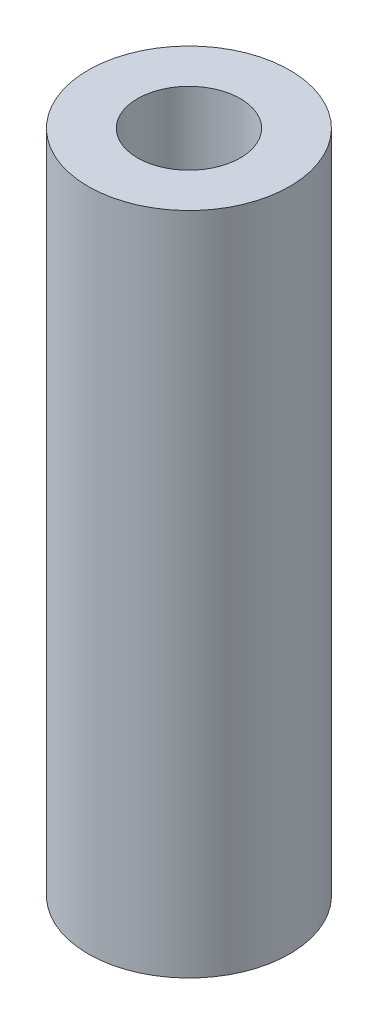
ISO-10303-21;
HEADER;
FILE_DESCRIPTION(('STEP AP214'),'2;1');
FILE_NAME('part.step','',(''),(''),'','','');
FILE_SCHEMA(('AUTOMOTIVE_DESIGN { 1 0 10303 214 1 1 1 1 }'));
ENDSEC;
DATA;
#1=APPLICATION_CONTEXT('core data for automotive mechanical design processes');
#2=APPLICATION_PROTOCOL_DEFINITION('international standard','automotive_design',2000,#1);
#3=PRODUCT_CONTEXT('',#1,'mechanical');
#4=PRODUCT('Part','Part','',(#3));
#5=PRODUCT_RELATED_PRODUCT_CATEGORY('part','',(#4));
#6=PRODUCT_DEFINITION_FORMATION('','',#4);
#7=PRODUCT_DEFINITION_CONTEXT('part definition',#1,'design');
#8=PRODUCT_DEFINITION('design','',#6,#7);
#9=PRODUCT_DEFINITION_SHAPE('','',#8);
#10=(LENGTH_UNIT() NAMED_UNIT(*) SI_UNIT(.MILLI.,.METRE.));
#11=(NAMED_UNIT(*) PLANE_ANGLE_UNIT() SI_UNIT($,.RADIAN.));
#12=(NAMED_UNIT(*) SI_UNIT($,.STERADIAN.) SOLID_ANGLE_UNIT());
#13=UNCERTAINTY_MEASURE_WITH_UNIT(LENGTH_MEASURE(1.E-05),#10,'distance_accuracy_value','');
#14=(GEOMETRIC_REPRESENTATION_CONTEXT(3) GLOBAL_UNCERTAINTY_ASSIGNED_CONTEXT((#13)) GLOBAL_UNIT_ASSIGNED_CONTEXT((#10,
#11,#12)) REPRESENTATION_CONTEXT('',''));
#15=CARTESIAN_POINT('',(0.,0.,0.));
#16=DIRECTION('',(0.,0.,1.));
#17=DIRECTION('',(1.,0.,0.));
#18=AXIS2_PLACEMENT_3D('',#15,#16,#17);
#19=CARTESIAN_POINT('',(0.,51.308,0.));
#20=DIRECTION('',(0.,1.,0.));
#21=DIRECTION('',(0.,0.,1.));
#22=AXIS2_PLACEMENT_3D('',#19,#20,#21);
#23=PLANE('',#22);
#24=CARTESIAN_POINT('',(0.,51.308,0.));
#25=DIRECTION('',(0.,1.,0.));
#26=DIRECTION('',(0.,0.,1.));
#27=AXIS2_PLACEMENT_3D('',#24,#25,#26);
#28=CIRCLE('',#27,7.77875);
#29=CARTESIAN_POINT('',(0.,51.308,7.77875));
#30=VERTEX_POINT('',#29);
#31=EDGE_CURVE('E10',#30,#30,#28,.T.);
#32=ORIENTED_EDGE('',*,*,#31,.T.);
#33=EDGE_LOOP('',(#32));
#34=FACE_BOUND('',#33,.T.);
#35=CARTESIAN_POINT('',(0.,51.308,0.));
#36=DIRECTION('',(0.,1.,0.));
#37=DIRECTION('',(0.,0.,1.));
#38=AXIS2_PLACEMENT_3D('',#35,#36,#37);
#39=CIRCLE('',#38,3.96875);
#40=CARTESIAN_POINT('',(0.,51.308,3.96875));
#41=VERTEX_POINT('',#40);
#42=EDGE_CURVE('E44',#41,#41,#39,.T.);
#43=ORIENTED_EDGE('',*,*,#42,.F.);
#44=EDGE_LOOP('',(#43));
#45=FACE_BOUND('',#44,.T.);
#46=ADVANCED_FACE('F33',(#34,#45),#23,.T.);
#47=CARTESIAN_POINT('',(0.,0.,0.));
#48=DIRECTION('',(0.,1.,0.));
#49=DIRECTION('',(0.,0.,1.));
#50=AXIS2_PLACEMENT_3D('',#47,#48,#49);
#51=PLANE('',#50);
#52=CARTESIAN_POINT('',(0.,0.,0.));
#53=DIRECTION('',(0.,1.,0.));
#54=DIRECTION('',(0.,0.,1.));
#55=AXIS2_PLACEMENT_3D('',#52,#53,#54);
#56=CIRCLE('',#55,7.77875);
#57=CARTESIAN_POINT('',(0.,0.,7.77875));
#58=VERTEX_POINT('',#57);
#59=EDGE_CURVE('E37',#58,#58,#56,.T.);
#60=ORIENTED_EDGE('',*,*,#59,.F.);
#61=EDGE_LOOP('',(#60));
#62=FACE_BOUND('',#61,.T.);
#63=CARTESIAN_POINT('',(0.,0.,0.));
#64=DIRECTION('',(0.,1.,0.));
#65=DIRECTION('',(0.,0.,1.));
#66=AXIS2_PLACEMENT_3D('',#63,#64,#65);
#67=CIRCLE('',#66,3.96875);
#68=CARTESIAN_POINT('',(0.,0.,3.96875));
#69=VERTEX_POINT('',#68);
#70=EDGE_CURVE('E46',#69,#69,#67,.T.);
#71=ORIENTED_EDGE('',*,*,#70,.T.);
#72=EDGE_LOOP('',(#71));
#73=FACE_BOUND('',#72,.T.);
#74=ADVANCED_FACE('F56',(#62,#73),#51,.F.);
#75=CARTESIAN_POINT('',(0.,51.308,0.));
#76=DIRECTION('',(0.,-1.,0.));
#77=DIRECTION('',(0.,0.,-1.));
#78=AXIS2_PLACEMENT_3D('',#75,#76,#77);
#79=CYLINDRICAL_SURFACE('',#78,7.77875);
#80=ORIENTED_EDGE('',*,*,#31,.F.);
#81=EDGE_LOOP('',(#80));
#82=FACE_BOUND('',#81,.T.);
#83=ORIENTED_EDGE('',*,*,#59,.T.);
#84=EDGE_LOOP('',(#83));
#85=FACE_BOUND('',#84,.T.);
#86=ADVANCED_FACE('F35',(#82,#85),#79,.T.);
#87=CARTESIAN_POINT('',(0.,51.308,0.));
#88=DIRECTION('',(0.,-1.,0.));
#89=DIRECTION('',(0.,0.,-1.));
#90=AXIS2_PLACEMENT_3D('',#87,#88,#89);
#91=CYLINDRICAL_SURFACE('',#90,3.96875);
#92=ORIENTED_EDGE('',*,*,#42,.T.);
#93=EDGE_LOOP('',(#92));
#94=FACE_BOUND('',#93,.T.);
#95=ORIENTED_EDGE('',*,*,#70,.F.);
#96=EDGE_LOOP('',(#95));
#97=FACE_BOUND('',#96,.T.);
#98=ADVANCED_FACE('F52',(#94,#97),#91,.F.);
#99=CLOSED_SHELL('',(#46,#74,#86,#98));
#100=MANIFOLD_SOLID_BREP('B2',#99);
#101=ADVANCED_BREP_SHAPE_REPRESENTATION('',(#18,#100),#14);
#102=SHAPE_DEFINITION_REPRESENTATION(#9,#101);
ENDSEC;
END-ISO-10303-21;
